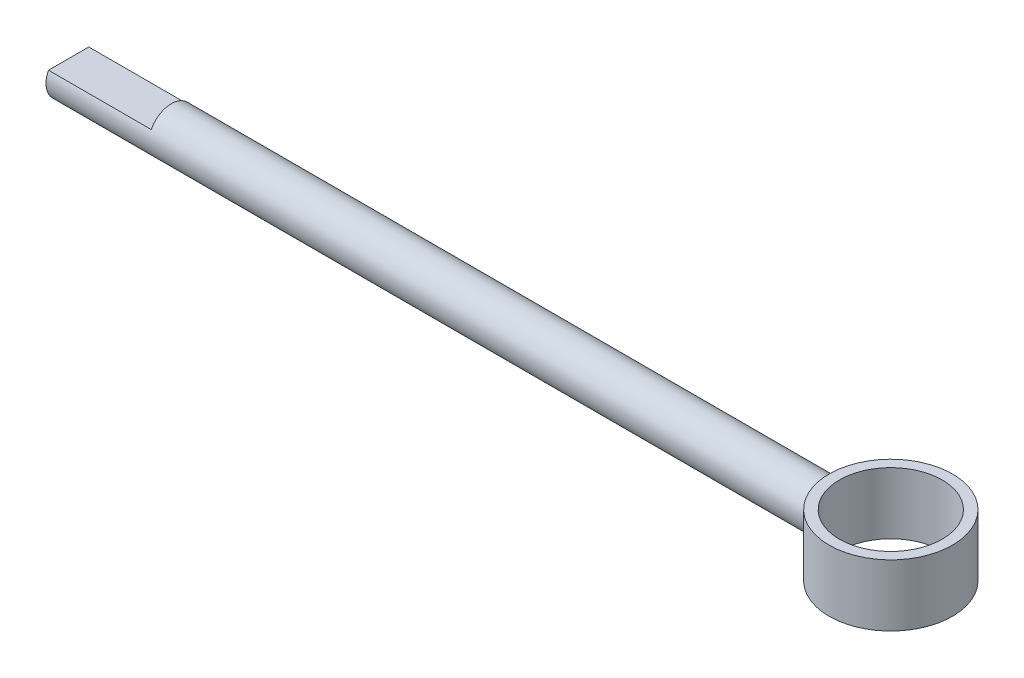
ISO-10303-21;
HEADER;
FILE_DESCRIPTION(('STEP AP214'),'2;1');
FILE_NAME('part.step','',(''),(''),'','','');
FILE_SCHEMA(('AUTOMOTIVE_DESIGN { 1 0 10303 214 1 1 1 1 }'));
ENDSEC;
DATA;
#1=APPLICATION_CONTEXT('core data for automotive mechanical design processes');
#2=APPLICATION_PROTOCOL_DEFINITION('international standard','automotive_design',2000,#1);
#3=PRODUCT_CONTEXT('',#1,'mechanical');
#4=PRODUCT('Part','Part','',(#3));
#5=PRODUCT_RELATED_PRODUCT_CATEGORY('part','',(#4));
#6=PRODUCT_DEFINITION_FORMATION('','',#4);
#7=PRODUCT_DEFINITION_CONTEXT('part definition',#1,'design');
#8=PRODUCT_DEFINITION('design','',#6,#7);
#9=PRODUCT_DEFINITION_SHAPE('','',#8);
#10=(LENGTH_UNIT() NAMED_UNIT(*) SI_UNIT(.MILLI.,.METRE.));
#11=(NAMED_UNIT(*) PLANE_ANGLE_UNIT() SI_UNIT($,.RADIAN.));
#12=(NAMED_UNIT(*) SI_UNIT($,.STERADIAN.) SOLID_ANGLE_UNIT());
#13=UNCERTAINTY_MEASURE_WITH_UNIT(LENGTH_MEASURE(1.E-05),#10,'distance_accuracy_value','');
#14=(GEOMETRIC_REPRESENTATION_CONTEXT(3) GLOBAL_UNCERTAINTY_ASSIGNED_CONTEXT((#13)) GLOBAL_UNIT_ASSIGNED_CONTEXT((#10,
#11,#12)) REPRESENTATION_CONTEXT('',''));
#15=CARTESIAN_POINT('',(0.,0.,0.));
#16=DIRECTION('',(0.,0.,1.));
#17=DIRECTION('',(1.,0.,0.));
#18=AXIS2_PLACEMENT_3D('',#15,#16,#17);
#19=CARTESIAN_POINT('',(0.,0.,0.));
#20=DIRECTION('',(-1.,0.,0.));
#21=DIRECTION('',(0.,0.,1.));
#22=AXIS2_PLACEMENT_3D('',#19,#20,#21);
#23=PLANE('',#22);
#24=CARTESIAN_POINT('',(0.,0.,0.));
#25=DIRECTION('',(-1.,0.,0.));
#26=DIRECTION('',(0.,0.,1.));
#27=AXIS2_PLACEMENT_3D('',#24,#25,#26);
#28=CIRCLE('',#27,11.);
#29=CARTESIAN_POINT('',(0.,5.,-9.79795897113271));
#30=VERTEX_POINT('',#29);
#31=CARTESIAN_POINT('',(0.,5.,9.79795897113271));
#32=VERTEX_POINT('',#31);
#33=EDGE_CURVE('E60',#30,#32,#28,.T.);
#34=ORIENTED_EDGE('',*,*,#33,.T.);
#35=DIRECTION('',(0.,0.,-1.));
#36=VECTOR('',#35,1.);
#37=CARTESIAN_POINT('',(0.,5.,0.));
#38=LINE('',#37,#36);
#39=EDGE_CURVE('E71',#32,#30,#38,.T.);
#40=ORIENTED_EDGE('',*,*,#39,.T.);
#41=EDGE_LOOP('',(#34,#40));
#42=FACE_BOUND('',#41,.T.);
#43=ADVANCED_FACE('F42',(#42),#23,.T.);
#44=CARTESIAN_POINT('',(0.,0.,0.));
#45=DIRECTION('',(-1.,0.,0.));
#46=DIRECTION('',(0.,0.,1.));
#47=AXIS2_PLACEMENT_3D('',#44,#45,#46);
#48=CYLINDRICAL_SURFACE('',#47,11.);
#49=CARTESIAN_POINT('',(372.089428526094,0.,11.));
#50=CARTESIAN_POINT('',(372.089429534477,-0.297552479069313,11.000001136164));
#51=CARTESIAN_POINT('',(372.084657474826,-0.595089231614994,10.9879169264649));
#52=CARTESIAN_POINT('',(372.065731752191,-1.18789239792202,10.9397135089089));
#53=CARTESIAN_POINT('',(372.051578723711,-1.48315896386606,10.9035959266004));
#54=CARTESIAN_POINT('',(372.014357071645,-2.06924000708324,10.8077020896628));
#55=CARTESIAN_POINT('',(371.991288566876,-2.36005454363504,10.7479261503293));
#56=CARTESIAN_POINT('',(371.936975354404,-2.93518736550316,10.6053034209551));
#57=CARTESIAN_POINT('',(371.905730441735,-3.21950548777391,10.5224560525595));
#58=CARTESIAN_POINT('',(371.836119359969,-3.77902751163989,10.3346898786145));
#59=CARTESIAN_POINT('',(371.797771593047,-4.05425284760613,10.229828016908));
#60=CARTESIAN_POINT('',(371.715015564537,-4.59474794528261,9.99873558262804));
#61=CARTESIAN_POINT('',(371.670605048179,-4.86001395604551,9.87249705573599));
#62=CARTESIAN_POINT('',(371.576981881416,-5.37895030891291,9.59962688548786));
#63=CARTESIAN_POINT('',(371.527769160582,-5.63262048087305,9.45299494302915));
#64=CARTESIAN_POINT('',(371.425861217527,-6.12698355296415,9.14032947646616));
#65=CARTESIAN_POINT('',(371.373165756292,-6.36767556036968,8.97429462018073));
#66=CARTESIAN_POINT('',(371.263332042331,-6.84487459611127,8.61629027213489));
#67=CARTESIAN_POINT('',(371.206100198575,-7.0807527601461,8.4235107832367));
#68=CARTESIAN_POINT('',(371.090881043497,-7.5356207222563,8.01916619538091));
#69=CARTESIAN_POINT('',(371.032893715023,-7.75461013610622,7.80760066926927));
#70=CARTESIAN_POINT('',(370.91768860418,-8.17444799920841,7.36688801816192));
#71=CARTESIAN_POINT('',(370.860470989831,-8.37529254061832,7.13773712538424));
#72=CARTESIAN_POINT('',(370.748319650766,-8.75752189394868,6.66322912885971));
#73=CARTESIAN_POINT('',(370.69338585596,-8.93890730333236,6.41787252305872));
#74=CARTESIAN_POINT('',(370.585503944225,-9.28659164551273,5.90411135899799));
#75=CARTESIAN_POINT('',(370.532679251366,-9.45220449399055,5.63521580164559));
#76=CARTESIAN_POINT('',(370.432507920446,-9.76000843563197,5.08350027659317));
#77=CARTESIAN_POINT('',(370.385159093153,-9.90220889868892,4.800685938492));
#78=CARTESIAN_POINT('',(370.297274373683,-10.1620304169355,4.22296635411732));
#79=CARTESIAN_POINT('',(370.256738198682,-10.279652492541,3.92806161040702));
#80=CARTESIAN_POINT('',(370.183667771558,-10.489200171684,3.32829829062163));
#81=CARTESIAN_POINT('',(370.15113309774,-10.5811271294434,3.02344024006647));
#82=CARTESIAN_POINT('',(370.096201811891,-10.7350872373734,2.41891022549162));
#83=CARTESIAN_POINT('',(370.073441171936,-10.7982006574253,2.11954627489302));
#84=CARTESIAN_POINT('',(370.036807529876,-10.8993178771539,1.51606776431766));
#85=CARTESIAN_POINT('',(370.022934303888,-10.9373223093475,1.21195332420739));
#86=CARTESIAN_POINT('',(370.004474453481,-10.9878162384718,0.60141361776199));
#87=CARTESIAN_POINT('',(369.999885358313,-11.0003125237912,0.294988988022696));
#88=CARTESIAN_POINT('',(370.00011898767,-10.9996756235214,-0.317825767964752));
#89=CARTESIAN_POINT('',(370.004941441933,-10.9865431738861,-0.624215894951018));
#90=CARTESIAN_POINT('',(370.023408216231,-10.9360216226491,-1.22006234908906));
#91=CARTESIAN_POINT('',(370.036623516188,-10.8998118708082,-1.50963291574976));
#92=CARTESIAN_POINT('',(370.071121783431,-10.8046156290203,-2.08450493705642));
#93=CARTESIAN_POINT('',(370.092404448722,-10.7456299916716,-2.36980655109223));
#94=CARTESIAN_POINT('',(370.142494425001,-10.605419458005,-2.93421903351126));
#95=CARTESIAN_POINT('',(370.17130200778,-10.5241937584017,-3.21332967789011));
#96=CARTESIAN_POINT('',(370.235718959956,-10.3402053448431,-3.76355000150963));
#97=CARTESIAN_POINT('',(370.271328501378,-10.2374420861853,-4.03465947819642));
#98=CARTESIAN_POINT('',(370.349018718579,-10.0096111913849,-4.57096950929661));
#99=CARTESIAN_POINT('',(370.391183546281,-9.88424953484716,-4.83603287724014));
#100=CARTESIAN_POINT('',(370.480581672451,-9.61313870935652,-5.35473999188958));
#101=CARTESIAN_POINT('',(370.527816798676,-9.46738218261766,-5.60837957342767));
#102=CARTESIAN_POINT('',(370.62619850686,-9.15652488983757,-6.10272991115057));
#103=CARTESIAN_POINT('',(370.677345329584,-8.99142293275395,-6.34343986996377));
#104=CARTESIAN_POINT('',(370.782322506156,-8.64293245378729,-6.81062832593688));
#105=CARTESIAN_POINT('',(370.836153035549,-8.45954273489586,-7.03710588994495));
#106=CARTESIAN_POINT('',(370.948275273834,-8.06476946288245,-7.48692155904075));
#107=CARTESIAN_POINT('',(371.006647690115,-7.8523919262852,-7.70936808344032));
#108=CARTESIAN_POINT('',(371.123383023592,-7.40976208927589,-8.13571490169174));
#109=CARTESIAN_POINT('',(371.181745940408,-7.1795091937871,-8.33961457762162));
#110=CARTESIAN_POINT('',(371.296880970934,-6.70243454566805,-8.72765345274409));
#111=CARTESIAN_POINT('',(371.353652675608,-6.45560858714719,-8.91178760482276));
#112=CARTESIAN_POINT('',(371.463987468344,-5.94690239646318,-9.25900547918172));
#113=CARTESIAN_POINT('',(371.517550699463,-5.6850228365164,-9.42209014037015));
#114=CARTESIAN_POINT('',(371.620963973647,-5.14219021844091,-9.729189139834));
#115=CARTESIAN_POINT('',(371.670713985144,-4.8609542505636,-9.87273789640764));
#116=CARTESIAN_POINT('',(371.763626337313,-4.28638715398927,-10.135414073519));
#117=CARTESIAN_POINT('',(371.806791458806,-3.9930611977774,-10.2545518102428));
#118=CARTESIAN_POINT('',(371.885100494887,-3.39632522920847,-10.4673440547496));
#119=CARTESIAN_POINT('',(371.920246100446,-3.09291735818035,-10.5610039355201));
#120=CARTESIAN_POINT('',(371.9812861746,-2.47826573714749,-10.7218980968793));
#121=CARTESIAN_POINT('',(372.007181244491,-2.16702249785954,-10.7891340950811));
#122=CARTESIAN_POINT('',(372.047666966414,-1.55591780533195,-10.8935779417597));
#123=CARTESIAN_POINT('',(372.062785520864,-1.25633121737905,-10.9321924497074));
#124=CARTESIAN_POINT('',(372.083370203046,-0.654668628823955,-10.9846522043158));
#125=CARTESIAN_POINT('',(372.088836673572,-0.352592717013312,-10.9984983306296));
#126=CARTESIAN_POINT('',(372.08992906788,0.251626637365814,-11.0012699829924));
#127=CARTESIAN_POINT('',(372.085557027909,0.553770053021799,-10.9902006657161));
#128=CARTESIAN_POINT('',(372.067126955426,1.15582236975515,-10.9432736087378));
#129=CARTESIAN_POINT('',(372.053069094931,1.45573131042026,-10.90741630926));
#130=CARTESIAN_POINT('',(372.016585133526,2.03765568233673,-10.8134591107292));
#131=CARTESIAN_POINT('',(371.994562755954,2.3198702421852,-10.7564292638789));
#132=CARTESIAN_POINT('',(371.942776638923,2.87839044016311,-10.620616506962));
#133=CARTESIAN_POINT('',(371.913010184202,3.15469396889372,-10.5418259664696));
#134=CARTESIAN_POINT('',(371.84661491267,3.69948499292418,-10.3632028725685));
#135=CARTESIAN_POINT('',(371.809987637494,3.96797422847875,-10.2633750456405));
#136=CARTESIAN_POINT('',(371.7308753066,4.49572219288515,-10.0434179779814));
#137=CARTESIAN_POINT('',(371.688387977499,4.75497729003639,-9.92328085423772));
#138=CARTESIAN_POINT('',(371.597087777015,5.27185379699033,-9.6589244210228));
#139=CARTESIAN_POINT('',(371.548102390482,5.52908127345315,-9.5139945155984));
#140=CARTESIAN_POINT('',(371.446395472522,6.0306451037198,-9.20425129185276));
#141=CARTESIAN_POINT('',(371.393672282299,6.27497564902714,-9.03942912248071));
#142=CARTESIAN_POINT('',(371.285891535845,6.74932487263131,-8.69098530928313));
#143=CARTESIAN_POINT('',(371.230833777095,6.97934230501005,-8.50736203254181));
#144=CARTESIAN_POINT('',(371.119788088028,7.42381010458368,-8.12240647656295));
#145=CARTESIAN_POINT('',(371.063800129335,7.63825999579779,-7.92107365626837));
#146=CARTESIAN_POINT('',(370.948913842526,8.06287007260847,-7.489144670646));
#147=CARTESIAN_POINT('',(370.890043993566,8.27198871499316,-7.25751547766731));
#148=CARTESIAN_POINT('',(370.774463835608,8.66996060636681,-6.77709720680831));
#149=CARTESIAN_POINT('',(370.717752770962,8.85882098930532,-6.52831422067589));
#150=CARTESIAN_POINT('',(370.607999480255,9.21512016622738,-6.01491706643224));
#151=CARTESIAN_POINT('',(370.554958828885,9.38254979177431,-5.75029619318644));
#152=CARTESIAN_POINT('',(370.454063689572,9.69454181629522,-5.20710202901209));
#153=CARTESIAN_POINT('',(370.406206989874,9.83911397969691,-4.92853476313771));
#154=CARTESIAN_POINT('',(370.31718043167,10.1037243081344,-4.36034044729852));
#155=CARTESIAN_POINT('',(370.275984356935,10.2238591659274,-4.07076258852985));
#156=CARTESIAN_POINT('',(370.201221470037,10.4392244898192,-3.48152010186189));
#157=CARTESIAN_POINT('',(370.167654689656,10.5344548521738,-3.18185543194994));
#158=CARTESIAN_POINT('',(370.109141776812,10.6990337963889,-2.57478941029768));
#159=CARTESIAN_POINT('',(370.084192465986,10.7683919214112,-2.26739095596882));
#160=CARTESIAN_POINT('',(370.043642652542,10.8805370958162,-1.64718084802646));
#161=CARTESIAN_POINT('',(370.028041641434,10.9233255904298,-1.33436948979449));
#162=CARTESIAN_POINT('',(370.007256921999,10.9802225702498,-0.723515136912356));
#163=CARTESIAN_POINT('',(370.001538562567,10.9958035213752,-0.425626574206677));
#164=CARTESIAN_POINT('',(369.999004008689,11.0027166957537,0.170463376926684));
#165=CARTESIAN_POINT('',(370.002187461035,10.9940498811148,0.468664752473207));
#166=CARTESIAN_POINT('',(370.017368753236,10.952558893976,1.06311959069197));
#167=CARTESIAN_POINT('',(370.029365652259,10.9197372999881,1.35937325787573));
#168=CARTESIAN_POINT('',(370.061847815219,10.8302673850521,1.94778506925991));
#169=CARTESIAN_POINT('',(370.08233308014,10.7736190613393,2.23994321298511));
#170=CARTESIAN_POINT('',(370.130691279392,10.6385844378558,2.81155021456863));
#171=CARTESIAN_POINT('',(370.158387090582,10.5607174695828,3.09113709719403));
#172=CARTESIAN_POINT('',(370.220668810705,10.3834219307803,3.64258585360537));
#173=CARTESIAN_POINT('',(370.255254570699,10.2839938263261,3.91444789423135));
#174=CARTESIAN_POINT('',(370.330466187398,10.0643863993047,4.44877051720649));
#175=CARTESIAN_POINT('',(370.371091811897,9.94420787446693,4.71123146050339));
#176=CARTESIAN_POINT('',(370.45742362701,9.68395009210387,5.22533811134389));
#177=CARTESIAN_POINT('',(370.503131744447,9.54386328151372,5.47697966667225));
#178=CARTESIAN_POINT('',(370.600485763965,9.23867924685966,5.97798578677649));
#179=CARTESIAN_POINT('',(370.652297827136,9.0727948717519,6.22683869163411));
#180=CARTESIAN_POINT('',(370.758956041468,8.72161923058772,6.70988526653798));
#181=CARTESIAN_POINT('',(370.813803241504,8.53632123561632,6.94407380856541));
#182=CARTESIAN_POINT('',(370.925147382834,8.14749950028945,7.39643265581927));
#183=CARTESIAN_POINT('',(370.981644552062,7.94397323370636,7.61460073314603));
#184=CARTESIAN_POINT('',(371.094857808274,7.51990657733523,8.03367141396861));
#185=CARTESIAN_POINT('',(371.151573903772,7.29936551937018,8.23457333876076));
#186=CARTESIAN_POINT('',(371.266586930698,6.83103870995873,8.62757063283991));
#187=CARTESIAN_POINT('',(371.324820440528,6.58244123023133,8.81871866982305));
#188=CARTESIAN_POINT('',(371.438212402857,6.06945227613616,9.17932541042327));
#189=CARTESIAN_POINT('',(371.493371912494,5.80506629698062,9.3487915966505));
#190=CARTESIAN_POINT('',(371.598998582445,5.26192497738444,9.66493250325157));
#191=CARTESIAN_POINT('',(371.649463543525,4.98316299638276,9.8115965629928));
#192=CARTESIAN_POINT('',(371.744054184721,4.41331694017981,10.0807679224883));
#193=CARTESIAN_POINT('',(371.788182599132,4.12223825041063,10.2032856502235));
#194=CARTESIAN_POINT('',(371.869680279682,3.52213673787354,10.425907124403));
#195=CARTESIAN_POINT('',(371.90684983878,3.21284608337762,10.5253639287535));
#196=CARTESIAN_POINT('',(371.971644518397,2.58572232685905,10.6967143010415));
#197=CARTESIAN_POINT('',(371.999269375568,2.26788898939634,10.7686071084678));
#198=CARTESIAN_POINT('',(372.043904045565,1.6265224959131,10.8839576174914));
#199=CARTESIAN_POINT('',(372.060919091949,1.30299223115985,10.9274293390257));
#200=CARTESIAN_POINT('',(372.083680264617,0.65296815129515,10.9854485866648));
#201=CARTESIAN_POINT('',(372.089427419696,0.326474609475116,10.9999987534008));
#202=CARTESIAN_POINT('',(372.089428526094,0.,11.));
#203=B_SPLINE_CURVE_WITH_KNOTS('',3,(#49,#50,#51,#52,#53,#54,#55,#56,#57,#58,#59,#60,#61,#62,
#63,#64,#65,#66,#67,#68,#69,#70,#71,#72,#73,#74,#75,#76,#77,#78,#79,#80,#81,#82,#83,#84,#85,#86,
#87,#88,#89,#90,#91,#92,#93,#94,#95,#96,#97,#98,#99,#100,#101,#102,#103,#104,#105,#106,#107,
#108,#109,#110,#111,#112,#113,#114,#115,#116,#117,#118,#119,#120,#121,#122,#123,#124,#125,#126,
#127,#128,#129,#130,#131,#132,#133,#134,#135,#136,#137,#138,#139,#140,#141,#142,#143,#144,#145,
#146,#147,#148,#149,#150,#151,#152,#153,#154,#155,#156,#157,#158,#159,#160,#161,#162,#163,#164,
#165,#166,#167,#168,#169,#170,#171,#172,#173,#174,#175,#176,#177,#178,#179,#180,#181,#182,#183,
#184,#185,#186,#187,#188,#189,#190,#191,#192,#193,#194,#195,#196,#197,#198,#199,#200,#201,#202),
.UNSPECIFIED.,.T.,.F.,(4,2,2,2,2,2,2,2,2,2,2,2,2,2,2,2,2,2,2,2,2,2,2,2,2,2,2,2,2,2,2,2,2,2,2,2,
2,2,2,2,2,2,2,2,2,2,2,2,2,2,2,2,2,2,2,2,2,2,2,2,2,2,2,2,2,2,2,2,2,2,2,2,2,2,2,2,4),(0.,
0.892348449275668,1.78463654879659,2.67691275717236,3.56921133515464,4.45922967412263,
5.34957992216101,6.23994323001172,7.13036770511125,8.0592187267265,8.98809087382468,
9.91716259661402,10.8462057854912,11.8055874064873,12.7645841341887,13.7235410395056,
14.682447394931,15.6016453279006,16.5208201046011,17.4397502328114,18.3586539734504,
19.2339988303481,20.1093109225361,20.9846546341557,21.8600204865999,22.7477271498259,
23.6357548975767,24.5238373473925,25.4119779640182,26.3500267191885,27.28810671572,
28.2264256834025,29.1647027830892,30.1224365802501,31.0797647970088,32.0368909674387,
32.9939549121766,33.900125818035,34.8062645404468,35.7122157392857,36.6181508492227,
37.483442534231,38.3490380213775,39.214439240745,40.0801771383567,40.977044305771,
41.8743120152018,42.7716577204342,43.669030850651,44.6206082148,45.5718493730229,
46.5234961375252,47.4747352653156,48.4221340310258,49.3695367432417,50.3165896527537,
51.2635910436684,52.1575377542964,53.0514489952237,53.9452648253588,54.8390807592047,
55.7127288432345,56.5863580439713,57.4599536663693,58.3338816140888,59.2434606919881,
60.1533560868121,61.0633777783224,61.9734352249229,62.9291449581281,63.8845239721283,
64.8403483180097,65.7957589668948,66.7753897770173,67.7550476139326,68.734221826638,
69.7133066334735),.UNSPECIFIED.);
#204=CARTESIAN_POINT('',(372.089428526094,0.,11.));
#205=VERTEX_POINT('',#204);
#206=EDGE_CURVE('E12',#205,#205,#203,.T.);
#207=ORIENTED_EDGE('',*,*,#206,.F.);
#208=EDGE_LOOP('',(#207));
#209=FACE_BOUND('',#208,.T.);
#210=CARTESIAN_POINT('',(50.,0.,0.));
#211=DIRECTION('',(-1.,0.,0.));
#212=DIRECTION('',(0.,0.,1.));
#213=AXIS2_PLACEMENT_3D('',#210,#211,#212);
#214=CIRCLE('',#213,11.);
#215=CARTESIAN_POINT('',(50.,5.,9.79795897113271));
#216=VERTEX_POINT('',#215);
#217=CARTESIAN_POINT('',(50.,5.,-9.79795897113271));
#218=VERTEX_POINT('',#217);
#219=EDGE_CURVE('E84',#216,#218,#214,.T.);
#220=ORIENTED_EDGE('',*,*,#219,.F.);
#221=DIRECTION('',(-1.,0.,0.));
#222=VECTOR('',#221,1.);
#223=CARTESIAN_POINT('',(50.,5.,9.79795897113271));
#224=LINE('',#223,#222);
#225=EDGE_CURVE('E78',#216,#32,#224,.T.);
#226=ORIENTED_EDGE('',*,*,#225,.T.);
#227=ORIENTED_EDGE('',*,*,#33,.F.);
#228=DIRECTION('',(-1.,0.,0.));
#229=VECTOR('',#228,1.);
#230=CARTESIAN_POINT('',(50.,5.,-9.79795897113271));
#231=LINE('',#230,#229);
#232=EDGE_CURVE('E79',#218,#30,#231,.T.);
#233=ORIENTED_EDGE('',*,*,#232,.F.);
#234=EDGE_LOOP('',(#220,#226,#227,#233));
#235=FACE_BOUND('',#234,.T.);
#236=ADVANCED_FACE('F46',(#209,#235),#48,.T.);
#237=CARTESIAN_POINT('',(400.,-15.,0.));
#238=DIRECTION('',(0.,1.,0.));
#239=DIRECTION('',(0.,0.,1.));
#240=AXIS2_PLACEMENT_3D('',#237,#238,#239);
#241=CYLINDRICAL_SURFACE('',#240,30.);
#242=ORIENTED_EDGE('',*,*,#206,.T.);
#243=EDGE_LOOP('',(#242));
#244=FACE_BOUND('',#243,.T.);
#245=CARTESIAN_POINT('',(400.,-15.,0.));
#246=DIRECTION('',(0.,1.,0.));
#247=DIRECTION('',(0.,0.,1.));
#248=AXIS2_PLACEMENT_3D('',#245,#246,#247);
#249=CIRCLE('',#248,30.);
#250=CARTESIAN_POINT('',(400.,-15.,30.));
#251=VERTEX_POINT('',#250);
#252=EDGE_CURVE('E87',#251,#251,#249,.T.);
#253=ORIENTED_EDGE('',*,*,#252,.T.);
#254=EDGE_LOOP('',(#253));
#255=FACE_BOUND('',#254,.T.);
#256=CARTESIAN_POINT('',(400.,15.,0.));
#257=DIRECTION('',(0.,1.,0.));
#258=DIRECTION('',(0.,0.,1.));
#259=AXIS2_PLACEMENT_3D('',#256,#257,#258);
#260=CIRCLE('',#259,30.);
#261=CARTESIAN_POINT('',(400.,15.,30.));
#262=VERTEX_POINT('',#261);
#263=EDGE_CURVE('E90',#262,#262,#260,.T.);
#264=ORIENTED_EDGE('',*,*,#263,.F.);
#265=EDGE_LOOP('',(#264));
#266=FACE_BOUND('',#265,.T.);
#267=ADVANCED_FACE('F113',(#244,#255,#266),#241,.T.);
#268=CARTESIAN_POINT('',(0.,-15.,0.));
#269=DIRECTION('',(0.,1.,0.));
#270=DIRECTION('',(0.,0.,1.));
#271=AXIS2_PLACEMENT_3D('',#268,#269,#270);
#272=PLANE('',#271);
#273=CARTESIAN_POINT('',(400.,-15.,0.));
#274=DIRECTION('',(0.,1.,0.));
#275=DIRECTION('',(0.,0.,1.));
#276=AXIS2_PLACEMENT_3D('',#273,#274,#275);
#277=CIRCLE('',#276,25.);
#278=CARTESIAN_POINT('',(400.,-15.,25.));
#279=VERTEX_POINT('',#278);
#280=EDGE_CURVE('E94',#279,#279,#277,.T.);
#281=ORIENTED_EDGE('',*,*,#280,.T.);
#282=EDGE_LOOP('',(#281));
#283=FACE_BOUND('',#282,.T.);
#284=ORIENTED_EDGE('',*,*,#252,.F.);
#285=EDGE_LOOP('',(#284));
#286=FACE_BOUND('',#285,.T.);
#287=ADVANCED_FACE('F117',(#283,#286),#272,.F.);
#288=CARTESIAN_POINT('',(0.,15.,0.));
#289=DIRECTION('',(0.,1.,0.));
#290=DIRECTION('',(0.,0.,1.));
#291=AXIS2_PLACEMENT_3D('',#288,#289,#290);
#292=PLANE('',#291);
#293=CARTESIAN_POINT('',(400.,15.,0.));
#294=DIRECTION('',(0.,1.,0.));
#295=DIRECTION('',(0.,0.,1.));
#296=AXIS2_PLACEMENT_3D('',#293,#294,#295);
#297=CIRCLE('',#296,25.);
#298=CARTESIAN_POINT('',(400.,15.,25.));
#299=VERTEX_POINT('',#298);
#300=EDGE_CURVE('E92',#299,#299,#297,.T.);
#301=ORIENTED_EDGE('',*,*,#300,.F.);
#302=EDGE_LOOP('',(#301));
#303=FACE_BOUND('',#302,.T.);
#304=ORIENTED_EDGE('',*,*,#263,.T.);
#305=EDGE_LOOP('',(#304));
#306=FACE_BOUND('',#305,.T.);
#307=ADVANCED_FACE('F123',(#303,#306),#292,.T.);
#308=CARTESIAN_POINT('',(400.,-15.,0.));
#309=DIRECTION('',(0.,1.,0.));
#310=DIRECTION('',(0.,0.,1.));
#311=AXIS2_PLACEMENT_3D('',#308,#309,#310);
#312=CYLINDRICAL_SURFACE('',#311,25.);
#313=ORIENTED_EDGE('',*,*,#280,.F.);
#314=EDGE_LOOP('',(#313));
#315=FACE_BOUND('',#314,.T.);
#316=ORIENTED_EDGE('',*,*,#300,.T.);
#317=EDGE_LOOP('',(#316));
#318=FACE_BOUND('',#317,.T.);
#319=ADVANCED_FACE('F107',(#315,#318),#312,.F.);
#320=CARTESIAN_POINT('',(50.,5.,0.));
#321=DIRECTION('',(0.,1.,0.));
#322=DIRECTION('',(0.,0.,1.));
#323=AXIS2_PLACEMENT_3D('',#320,#321,#322);
#324=PLANE('',#323);
#325=ORIENTED_EDGE('',*,*,#39,.F.);
#326=ORIENTED_EDGE('',*,*,#225,.F.);
#327=DIRECTION('',(0.,0.,-1.));
#328=VECTOR('',#327,1.);
#329=CARTESIAN_POINT('',(50.,5.,0.));
#330=LINE('',#329,#328);
#331=EDGE_CURVE('E61',#216,#218,#330,.T.);
#332=ORIENTED_EDGE('',*,*,#331,.T.);
#333=ORIENTED_EDGE('',*,*,#232,.T.);
#334=EDGE_LOOP('',(#325,#326,#332,#333));
#335=FACE_BOUND('',#334,.T.);
#336=ADVANCED_FACE('F73',(#335),#324,.T.);
#337=CARTESIAN_POINT('',(50.,0.,0.));
#338=DIRECTION('',(-1.,0.,0.));
#339=DIRECTION('',(0.,0.,1.));
#340=AXIS2_PLACEMENT_3D('',#337,#338,#339);
#341=PLANE('',#340);
#342=ORIENTED_EDGE('',*,*,#331,.F.);
#343=ORIENTED_EDGE('',*,*,#219,.T.);
#344=EDGE_LOOP('',(#342,#343));
#345=FACE_BOUND('',#344,.T.);
#346=ADVANCED_FACE('F105',(#345),#341,.T.);
#347=CLOSED_SHELL('',(#43,#236,#267,#287,#307,#319,#336,#346));
#348=MANIFOLD_SOLID_BREP('B2',#347);
#349=ADVANCED_BREP_SHAPE_REPRESENTATION('',(#18,#348),#14);
#350=SHAPE_DEFINITION_REPRESENTATION(#9,#349);
ENDSEC;
END-ISO-10303-21;
